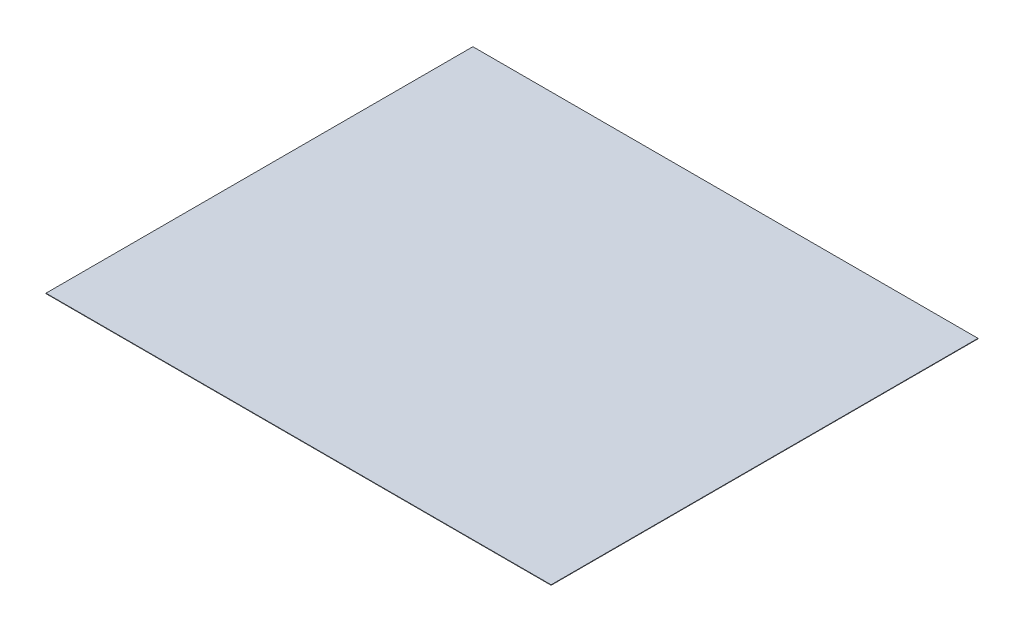
ISO-10303-21;
HEADER;
FILE_DESCRIPTION(('STEP AP214'),'2;1');
FILE_NAME('part.step','',(''),(''),'','','');
FILE_SCHEMA(('AUTOMOTIVE_DESIGN { 1 0 10303 214 1 1 1 1 }'));
ENDSEC;
DATA;
#1=APPLICATION_CONTEXT('core data for automotive mechanical design processes');
#2=APPLICATION_PROTOCOL_DEFINITION('international standard','automotive_design',2000,#1);
#3=PRODUCT_CONTEXT('',#1,'mechanical');
#4=PRODUCT('Part','Part','',(#3));
#5=PRODUCT_RELATED_PRODUCT_CATEGORY('part','',(#4));
#6=PRODUCT_DEFINITION_FORMATION('','',#4);
#7=PRODUCT_DEFINITION_CONTEXT('part definition',#1,'design');
#8=PRODUCT_DEFINITION('design','',#6,#7);
#9=PRODUCT_DEFINITION_SHAPE('','',#8);
#10=(LENGTH_UNIT() NAMED_UNIT(*) SI_UNIT(.MILLI.,.METRE.));
#11=(NAMED_UNIT(*) PLANE_ANGLE_UNIT() SI_UNIT($,.RADIAN.));
#12=(NAMED_UNIT(*) SI_UNIT($,.STERADIAN.) SOLID_ANGLE_UNIT());
#13=UNCERTAINTY_MEASURE_WITH_UNIT(LENGTH_MEASURE(1.E-05),#10,'distance_accuracy_value','');
#14=(GEOMETRIC_REPRESENTATION_CONTEXT(3) GLOBAL_UNCERTAINTY_ASSIGNED_CONTEXT((#13)) GLOBAL_UNIT_ASSIGNED_CONTEXT((#10,
#11,#12)) REPRESENTATION_CONTEXT('',''));
#15=CARTESIAN_POINT('',(0.,0.,0.));
#16=DIRECTION('',(0.,0.,1.));
#17=DIRECTION('',(1.,0.,0.));
#18=AXIS2_PLACEMENT_3D('',#15,#16,#17);
#19=CARTESIAN_POINT('',(-1009.52557221332,2.,-963.100000000001));
#20=DIRECTION('',(1.,0.,0.));
#21=DIRECTION('',(0.,0.,-1.));
#22=AXIS2_PLACEMENT_3D('',#19,#20,#21);
#23=PLANE('',#22);
#24=DIRECTION('',(0.,0.,1.));
#25=VECTOR('',#24,1.);
#26=CARTESIAN_POINT('',(-1009.52557221332,0.,-963.100000000001));
#27=LINE('',#26,#25);
#28=CARTESIAN_POINT('',(-1009.52557221332,0.,-963.100000000001));
#29=VERTEX_POINT('',#28);
#30=CARTESIAN_POINT('',(-1009.52557221332,0.,946.899999999999));
#31=VERTEX_POINT('',#30);
#32=EDGE_CURVE('E111',#29,#31,#27,.T.);
#33=ORIENTED_EDGE('',*,*,#32,.T.);
#34=DIRECTION('',(0.,-1.,0.));
#35=VECTOR('',#34,1.);
#36=CARTESIAN_POINT('',(-1009.52557221332,2.,946.899999999999));
#37=LINE('',#36,#35);
#38=CARTESIAN_POINT('',(-1009.52557221332,2.,946.899999999999));
#39=VERTEX_POINT('',#38);
#40=EDGE_CURVE('E11',#39,#31,#37,.T.);
#41=ORIENTED_EDGE('',*,*,#40,.F.);
#42=DIRECTION('',(0.,0.,1.));
#43=VECTOR('',#42,1.);
#44=CARTESIAN_POINT('',(-1009.52557221332,2.,-963.100000000001));
#45=LINE('',#44,#43);
#46=CARTESIAN_POINT('',(-1009.52557221332,2.,-963.100000000001));
#47=VERTEX_POINT('',#46);
#48=EDGE_CURVE('E95',#47,#39,#45,.T.);
#49=ORIENTED_EDGE('',*,*,#48,.F.);
#50=DIRECTION('',(0.,-1.,0.));
#51=VECTOR('',#50,1.);
#52=CARTESIAN_POINT('',(-1009.52557221332,2.,-963.100000000001));
#53=LINE('',#52,#51);
#54=EDGE_CURVE('E107',#47,#29,#53,.T.);
#55=ORIENTED_EDGE('',*,*,#54,.T.);
#56=EDGE_LOOP('',(#33,#41,#49,#55));
#57=FACE_BOUND('',#56,.T.);
#58=ADVANCED_FACE('F43',(#57),#23,.F.);
#59=CARTESIAN_POINT('',(-1009.52557221332,2.,946.899999999999));
#60=DIRECTION('',(0.,0.,-1.));
#61=DIRECTION('',(-1.,0.,0.));
#62=AXIS2_PLACEMENT_3D('',#59,#60,#61);
#63=PLANE('',#62);
#64=DIRECTION('',(1.,0.,0.));
#65=VECTOR('',#64,1.);
#66=CARTESIAN_POINT('',(-1009.52557221332,0.,946.899999999999));
#67=LINE('',#66,#65);
#68=CARTESIAN_POINT('',(1250.47442778668,0.,946.899999999999));
#69=VERTEX_POINT('',#68);
#70=EDGE_CURVE('E100',#31,#69,#67,.T.);
#71=ORIENTED_EDGE('',*,*,#70,.T.);
#72=DIRECTION('',(0.,-1.,0.));
#73=VECTOR('',#72,1.);
#74=CARTESIAN_POINT('',(1250.47442778668,2.,946.899999999999));
#75=LINE('',#74,#73);
#76=CARTESIAN_POINT('',(1250.47442778668,2.,946.899999999999));
#77=VERTEX_POINT('',#76);
#78=EDGE_CURVE('E52',#77,#69,#75,.T.);
#79=ORIENTED_EDGE('',*,*,#78,.F.);
#80=DIRECTION('',(1.,0.,0.));
#81=VECTOR('',#80,1.);
#82=CARTESIAN_POINT('',(-1009.52557221332,2.,946.899999999999));
#83=LINE('',#82,#81);
#84=EDGE_CURVE('E90',#39,#77,#83,.T.);
#85=ORIENTED_EDGE('',*,*,#84,.F.);
#86=ORIENTED_EDGE('',*,*,#40,.T.);
#87=EDGE_LOOP('',(#71,#79,#85,#86));
#88=FACE_BOUND('',#87,.T.);
#89=ADVANCED_FACE('F99',(#88),#63,.F.);
#90=CARTESIAN_POINT('',(1250.47442778668,2.,-963.100000000001));
#91=DIRECTION('',(-1.,0.,0.));
#92=DIRECTION('',(0.,0.,1.));
#93=AXIS2_PLACEMENT_3D('',#90,#91,#92);
#94=PLANE('',#93);
#95=DIRECTION('',(0.,0.,-1.));
#96=VECTOR('',#95,1.);
#97=CARTESIAN_POINT('',(1250.47442778668,0.,-963.100000000001));
#98=LINE('',#97,#96);
#99=CARTESIAN_POINT('',(1250.47442778668,0.,-963.100000000001));
#100=VERTEX_POINT('',#99);
#101=EDGE_CURVE('E77',#69,#100,#98,.T.);
#102=ORIENTED_EDGE('',*,*,#101,.T.);
#103=DIRECTION('',(0.,-1.,0.));
#104=VECTOR('',#103,1.);
#105=CARTESIAN_POINT('',(1250.47442778668,2.,-963.100000000001));
#106=LINE('',#105,#104);
#107=CARTESIAN_POINT('',(1250.47442778668,2.,-963.100000000001));
#108=VERTEX_POINT('',#107);
#109=EDGE_CURVE('E102',#108,#100,#106,.T.);
#110=ORIENTED_EDGE('',*,*,#109,.F.);
#111=DIRECTION('',(0.,0.,-1.));
#112=VECTOR('',#111,1.);
#113=CARTESIAN_POINT('',(1250.47442778668,2.,-963.100000000001));
#114=LINE('',#113,#112);
#115=EDGE_CURVE('E93',#77,#108,#114,.T.);
#116=ORIENTED_EDGE('',*,*,#115,.F.);
#117=ORIENTED_EDGE('',*,*,#78,.T.);
#118=EDGE_LOOP('',(#102,#110,#116,#117));
#119=FACE_BOUND('',#118,.T.);
#120=ADVANCED_FACE('F103',(#119),#94,.F.);
#121=CARTESIAN_POINT('',(-1009.52557221332,2.,-963.100000000001));
#122=DIRECTION('',(0.,0.,1.));
#123=DIRECTION('',(1.,0.,0.));
#124=AXIS2_PLACEMENT_3D('',#121,#122,#123);
#125=PLANE('',#124);
#126=DIRECTION('',(-1.,0.,0.));
#127=VECTOR('',#126,1.);
#128=CARTESIAN_POINT('',(-1009.52557221332,0.,-963.100000000001));
#129=LINE('',#128,#127);
#130=EDGE_CURVE('E83',#100,#29,#129,.T.);
#131=ORIENTED_EDGE('',*,*,#130,.T.);
#132=ORIENTED_EDGE('',*,*,#54,.F.);
#133=DIRECTION('',(-1.,0.,0.));
#134=VECTOR('',#133,1.);
#135=CARTESIAN_POINT('',(-1009.52557221332,2.,-963.100000000001));
#136=LINE('',#135,#134);
#137=EDGE_CURVE('E60',#108,#47,#136,.T.);
#138=ORIENTED_EDGE('',*,*,#137,.F.);
#139=ORIENTED_EDGE('',*,*,#109,.T.);
#140=EDGE_LOOP('',(#131,#132,#138,#139));
#141=FACE_BOUND('',#140,.T.);
#142=ADVANCED_FACE('F124',(#141),#125,.F.);
#143=CARTESIAN_POINT('',(0.,2.,0.));
#144=DIRECTION('',(0.,1.,0.));
#145=DIRECTION('',(0.,0.,1.));
#146=AXIS2_PLACEMENT_3D('',#143,#144,#145);
#147=PLANE('',#146);
#148=ORIENTED_EDGE('',*,*,#48,.T.);
#149=ORIENTED_EDGE('',*,*,#84,.T.);
#150=ORIENTED_EDGE('',*,*,#115,.T.);
#151=ORIENTED_EDGE('',*,*,#137,.T.);
#152=EDGE_LOOP('',(#148,#149,#150,#151));
#153=FACE_BOUND('',#152,.T.);
#154=ADVANCED_FACE('F91',(#153),#147,.T.);
#155=CARTESIAN_POINT('',(0.,0.,0.));
#156=DIRECTION('',(0.,1.,0.));
#157=DIRECTION('',(0.,0.,1.));
#158=AXIS2_PLACEMENT_3D('',#155,#156,#157);
#159=PLANE('',#158);
#160=ORIENTED_EDGE('',*,*,#32,.F.);
#161=ORIENTED_EDGE('',*,*,#130,.F.);
#162=ORIENTED_EDGE('',*,*,#101,.F.);
#163=ORIENTED_EDGE('',*,*,#70,.F.);
#164=EDGE_LOOP('',(#160,#161,#162,#163));
#165=FACE_BOUND('',#164,.T.);
#166=ADVANCED_FACE('F127',(#165),#159,.F.);
#167=CLOSED_SHELL('',(#58,#89,#120,#142,#154,#166));
#168=MANIFOLD_SOLID_BREP('B2',#167);
#169=ADVANCED_BREP_SHAPE_REPRESENTATION('',(#18,#168),#14);
#170=SHAPE_DEFINITION_REPRESENTATION(#9,#169);
ENDSEC;
END-ISO-10303-21;
